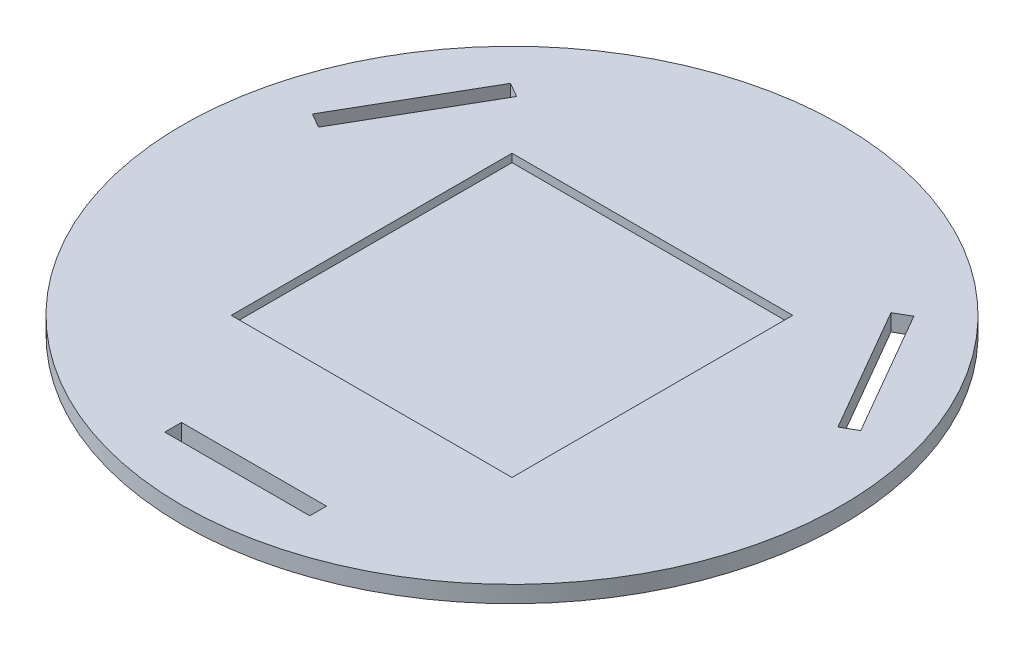
ISO-10303-21;
HEADER;
FILE_DESCRIPTION(('STEP AP214'),'2;1');
FILE_NAME('part.step','',(''),(''),'','','');
FILE_SCHEMA(('AUTOMOTIVE_DESIGN { 1 0 10303 214 1 1 1 1 }'));
ENDSEC;
DATA;
#1=APPLICATION_CONTEXT('core data for automotive mechanical design processes');
#2=APPLICATION_PROTOCOL_DEFINITION('international standard','automotive_design',2000,#1);
#3=PRODUCT_CONTEXT('',#1,'mechanical');
#4=PRODUCT('Part','Part','',(#3));
#5=PRODUCT_RELATED_PRODUCT_CATEGORY('part','',(#4));
#6=PRODUCT_DEFINITION_FORMATION('','',#4);
#7=PRODUCT_DEFINITION_CONTEXT('part definition',#1,'design');
#8=PRODUCT_DEFINITION('design','',#6,#7);
#9=PRODUCT_DEFINITION_SHAPE('','',#8);
#10=(LENGTH_UNIT() NAMED_UNIT(*) SI_UNIT(.MILLI.,.METRE.));
#11=(NAMED_UNIT(*) PLANE_ANGLE_UNIT() SI_UNIT($,.RADIAN.));
#12=(NAMED_UNIT(*) SI_UNIT($,.STERADIAN.) SOLID_ANGLE_UNIT());
#13=UNCERTAINTY_MEASURE_WITH_UNIT(LENGTH_MEASURE(1.E-05),#10,'distance_accuracy_value','');
#14=(GEOMETRIC_REPRESENTATION_CONTEXT(3) GLOBAL_UNCERTAINTY_ASSIGNED_CONTEXT((#13)) GLOBAL_UNIT_ASSIGNED_CONTEXT((#10,
#11,#12)) REPRESENTATION_CONTEXT('',''));
#15=CARTESIAN_POINT('',(0.,0.,0.));
#16=DIRECTION('',(0.,0.,1.));
#17=DIRECTION('',(1.,0.,0.));
#18=AXIS2_PLACEMENT_3D('',#15,#16,#17);
#19=CARTESIAN_POINT('',(0.,6.35,0.));
#20=DIRECTION('',(0.,-1.,0.));
#21=DIRECTION('',(0.,0.,-1.));
#22=AXIS2_PLACEMENT_3D('',#19,#20,#21);
#23=CYLINDRICAL_SURFACE('',#22,125.);
#24=CARTESIAN_POINT('',(0.,6.35,0.));
#25=DIRECTION('',(0.,1.,0.));
#26=DIRECTION('',(0.,0.,1.));
#27=AXIS2_PLACEMENT_3D('',#24,#25,#26);
#28=CIRCLE('',#27,125.);
#29=CARTESIAN_POINT('',(0.,6.35,125.));
#30=VERTEX_POINT('',#29);
#31=EDGE_CURVE('E11',#30,#30,#28,.T.);
#32=ORIENTED_EDGE('',*,*,#31,.F.);
#33=EDGE_LOOP('',(#32));
#34=FACE_BOUND('',#33,.T.);
#35=CARTESIAN_POINT('',(0.,0.,0.));
#36=DIRECTION('',(0.,1.,0.));
#37=DIRECTION('',(0.,0.,1.));
#38=AXIS2_PLACEMENT_3D('',#35,#36,#37);
#39=CIRCLE('',#38,125.);
#40=CARTESIAN_POINT('',(0.,0.,125.));
#41=VERTEX_POINT('',#40);
#42=EDGE_CURVE('E39',#41,#41,#39,.T.);
#43=ORIENTED_EDGE('',*,*,#42,.T.);
#44=EDGE_LOOP('',(#43));
#45=FACE_BOUND('',#44,.T.);
#46=ADVANCED_FACE('F36',(#34,#45),#23,.T.);
#47=CARTESIAN_POINT('',(0.,6.35,0.));
#48=DIRECTION('',(0.,1.,0.));
#49=DIRECTION('',(0.,0.,1.));
#50=AXIS2_PLACEMENT_3D('',#47,#48,#49);
#51=PLANE('',#50);
#52=DIRECTION('',(0.,0.,1.));
#53=VECTOR('',#52,1.);
#54=CARTESIAN_POINT('',(-53.25,6.35,-53.25));
#55=LINE('',#54,#53);
#56=CARTESIAN_POINT('',(-53.25,6.35,-53.25));
#57=VERTEX_POINT('',#56);
#58=CARTESIAN_POINT('',(-53.25,6.35,53.25));
#59=VERTEX_POINT('',#58);
#60=EDGE_CURVE('E50',#57,#59,#55,.T.);
#61=ORIENTED_EDGE('',*,*,#60,.F.);
#62=DIRECTION('',(-1.,0.,0.));
#63=VECTOR('',#62,1.);
#64=CARTESIAN_POINT('',(-53.25,6.35,-53.25));
#65=LINE('',#64,#63);
#66=CARTESIAN_POINT('',(53.25,6.35,-53.25));
#67=VERTEX_POINT('',#66);
#68=EDGE_CURVE('E168',#67,#57,#65,.T.);
#69=ORIENTED_EDGE('',*,*,#68,.F.);
#70=DIRECTION('',(0.,0.,-1.));
#71=VECTOR('',#70,1.);
#72=CARTESIAN_POINT('',(53.25,6.35,-53.25));
#73=LINE('',#72,#71);
#74=CARTESIAN_POINT('',(53.25,6.35,53.25));
#75=VERTEX_POINT('',#74);
#76=EDGE_CURVE('E171',#75,#67,#73,.T.);
#77=ORIENTED_EDGE('',*,*,#76,.F.);
#78=DIRECTION('',(1.,0.,0.));
#79=VECTOR('',#78,1.);
#80=CARTESIAN_POINT('',(-53.25,6.35,53.25));
#81=LINE('',#80,#79);
#82=EDGE_CURVE('E177',#59,#75,#81,.T.);
#83=ORIENTED_EDGE('',*,*,#82,.F.);
#84=EDGE_LOOP('',(#61,#69,#77,#83));
#85=FACE_BOUND('',#84,.T.);
#86=DIRECTION('',(0.5,0.,-0.866025403784439));
#87=VECTOR('',#86,1.);
#88=CARTESIAN_POINT('',(-98.5003693429845,6.35,-25.1149499500204));
#89=LINE('',#88,#87);
#90=CARTESIAN_POINT('',(-98.5003693429845,6.35,-25.1149499500204));
#91=VERTEX_POINT('',#90);
#92=CARTESIAN_POINT('',(-71.0003693429846,6.35,-72.7463471581644));
#93=VERTEX_POINT('',#92);
#94=EDGE_CURVE('E58',#91,#93,#89,.T.);
#95=ORIENTED_EDGE('',*,*,#94,.F.);
#96=DIRECTION('',(0.866025403784442,0.,0.499999999999994));
#97=VECTOR('',#96,1.);
#98=CARTESIAN_POINT('',(-98.5003693429845,6.35,-25.1149499500204));
#99=LINE('',#98,#97);
#100=CARTESIAN_POINT('',(-103.999630657016,6.35,-28.2899499500204));
#101=VERTEX_POINT('',#100);
#102=EDGE_CURVE('E191',#101,#91,#99,.T.);
#103=ORIENTED_EDGE('',*,*,#102,.F.);
#104=DIRECTION('',(-0.5,0.,0.866025403784439));
#105=VECTOR('',#104,1.);
#106=CARTESIAN_POINT('',(-103.999630657016,6.35,-28.2899499500204));
#107=LINE('',#106,#105);
#108=CARTESIAN_POINT('',(-76.4996306570159,6.35,-75.9213471581646));
#109=VERTEX_POINT('',#108);
#110=EDGE_CURVE('E206',#109,#101,#107,.T.);
#111=ORIENTED_EDGE('',*,*,#110,.F.);
#112=DIRECTION('',(-0.866025403784431,0.,-0.500000000000014));
#113=VECTOR('',#112,1.);
#114=CARTESIAN_POINT('',(-71.0003693429846,6.35,-72.7463471581644));
#115=LINE('',#114,#113);
#116=EDGE_CURVE('E202',#93,#109,#115,.T.);
#117=ORIENTED_EDGE('',*,*,#116,.F.);
#118=EDGE_LOOP('',(#95,#103,#111,#117));
#119=FACE_BOUND('',#118,.T.);
#120=DIRECTION('',(-0.866025403784439,0.,0.5));
#121=VECTOR('',#120,1.);
#122=CARTESIAN_POINT('',(76.4996306570162,6.35,-75.9213471581631));
#123=LINE('',#122,#121);
#124=CARTESIAN_POINT('',(76.4996306570162,6.35,-75.9213471581631));
#125=VERTEX_POINT('',#124);
#126=CARTESIAN_POINT('',(71.000369342985,6.35,-72.7463471581631));
#127=VERTEX_POINT('',#126);
#128=EDGE_CURVE('E232',#125,#127,#123,.T.);
#129=ORIENTED_EDGE('',*,*,#128,.F.);
#130=DIRECTION('',(-0.5,0.,-0.866025403784439));
#131=VECTOR('',#130,1.);
#132=CARTESIAN_POINT('',(103.999630657016,6.35,-28.289949950019));
#133=LINE('',#132,#131);
#134=CARTESIAN_POINT('',(103.999630657016,6.35,-28.289949950019));
#135=VERTEX_POINT('',#134);
#136=EDGE_CURVE('E222',#135,#125,#133,.T.);
#137=ORIENTED_EDGE('',*,*,#136,.F.);
#138=DIRECTION('',(0.866025403784438,0.,-0.5));
#139=VECTOR('',#138,1.);
#140=CARTESIAN_POINT('',(98.500369342985,6.35,-25.114949950019));
#141=LINE('',#140,#139);
#142=CARTESIAN_POINT('',(98.500369342985,6.35,-25.114949950019));
#143=VERTEX_POINT('',#142);
#144=EDGE_CURVE('E238',#143,#135,#141,.T.);
#145=ORIENTED_EDGE('',*,*,#144,.F.);
#146=DIRECTION('',(0.5,0.,0.866025403784439));
#147=VECTOR('',#146,1.);
#148=CARTESIAN_POINT('',(71.000369342985,6.35,-72.7463471581631));
#149=LINE('',#148,#147);
#150=EDGE_CURVE('E234',#127,#143,#149,.T.);
#151=ORIENTED_EDGE('',*,*,#150,.F.);
#152=EDGE_LOOP('',(#129,#137,#145,#151));
#153=FACE_BOUND('',#152,.T.);
#154=DIRECTION('',(0.,0.,1.));
#155=VECTOR('',#154,1.);
#156=CARTESIAN_POINT('',(-27.5000000000002,6.35,97.8612971081842));
#157=LINE('',#156,#155);
#158=CARTESIAN_POINT('',(-27.5000000000002,6.35,97.8612971081842));
#159=VERTEX_POINT('',#158);
#160=CARTESIAN_POINT('',(-27.5000000000002,6.35,104.211297108184));
#161=VERTEX_POINT('',#160);
#162=EDGE_CURVE('E183',#159,#161,#157,.T.);
#163=ORIENTED_EDGE('',*,*,#162,.F.);
#164=DIRECTION('',(-1.,0.,0.));
#165=VECTOR('',#164,1.);
#166=CARTESIAN_POINT('',(-27.5000000000002,6.35,97.8612971081842));
#167=LINE('',#166,#165);
#168=CARTESIAN_POINT('',(27.4999999999998,6.35,97.8612971081842));
#169=VERTEX_POINT('',#168);
#170=EDGE_CURVE('E254',#169,#159,#167,.T.);
#171=ORIENTED_EDGE('',*,*,#170,.F.);
#172=DIRECTION('',(0.,0.,-1.));
#173=VECTOR('',#172,1.);
#174=CARTESIAN_POINT('',(27.4999999999998,6.35,97.8612971081842));
#175=LINE('',#174,#173);
#176=CARTESIAN_POINT('',(27.4999999999998,6.35,104.211297108184));
#177=VERTEX_POINT('',#176);
#178=EDGE_CURVE('E268',#177,#169,#175,.T.);
#179=ORIENTED_EDGE('',*,*,#178,.F.);
#180=DIRECTION('',(1.,0.,0.));
#181=VECTOR('',#180,1.);
#182=CARTESIAN_POINT('',(-27.5000000000002,6.35,104.211297108184));
#183=LINE('',#182,#181);
#184=EDGE_CURVE('E265',#161,#177,#183,.T.);
#185=ORIENTED_EDGE('',*,*,#184,.F.);
#186=EDGE_LOOP('',(#163,#171,#179,#185));
#187=FACE_BOUND('',#186,.T.);
#188=ORIENTED_EDGE('',*,*,#31,.T.);
#189=EDGE_LOOP('',(#188));
#190=FACE_BOUND('',#189,.T.);
#191=ADVANCED_FACE('F289',(#85,#119,#153,#187,#190),#51,.T.);
#192=CARTESIAN_POINT('',(0.,0.,0.));
#193=DIRECTION('',(0.,1.,0.));
#194=DIRECTION('',(0.,0.,1.));
#195=AXIS2_PLACEMENT_3D('',#192,#193,#194);
#196=PLANE('',#195);
#197=DIRECTION('',(0.866025403784442,0.,0.499999999999994));
#198=VECTOR('',#197,1.);
#199=CARTESIAN_POINT('',(-98.5003693429845,0.,-25.1149499500204));
#200=LINE('',#199,#198);
#201=CARTESIAN_POINT('',(-103.999630657016,0.,-28.2899499500204));
#202=VERTEX_POINT('',#201);
#203=CARTESIAN_POINT('',(-98.5003693429845,0.,-25.1149499500204));
#204=VERTEX_POINT('',#203);
#205=EDGE_CURVE('E197',#202,#204,#200,.T.);
#206=ORIENTED_EDGE('',*,*,#205,.T.);
#207=DIRECTION('',(0.5,0.,-0.866025403784439));
#208=VECTOR('',#207,1.);
#209=CARTESIAN_POINT('',(-98.5003693429845,0.,-25.1149499500204));
#210=LINE('',#209,#208);
#211=CARTESIAN_POINT('',(-71.0003693429846,0.,-72.7463471581644));
#212=VERTEX_POINT('',#211);
#213=EDGE_CURVE('E187',#204,#212,#210,.T.);
#214=ORIENTED_EDGE('',*,*,#213,.T.);
#215=DIRECTION('',(-0.866025403784431,0.,-0.500000000000014));
#216=VECTOR('',#215,1.);
#217=CARTESIAN_POINT('',(-71.0003693429846,0.,-72.7463471581644));
#218=LINE('',#217,#216);
#219=CARTESIAN_POINT('',(-76.4996306570159,0.,-75.9213471581646));
#220=VERTEX_POINT('',#219);
#221=EDGE_CURVE('E190',#212,#220,#218,.T.);
#222=ORIENTED_EDGE('',*,*,#221,.T.);
#223=DIRECTION('',(-0.5,0.,0.866025403784439));
#224=VECTOR('',#223,1.);
#225=CARTESIAN_POINT('',(-103.999630657016,0.,-28.2899499500204));
#226=LINE('',#225,#224);
#227=EDGE_CURVE('E194',#220,#202,#226,.T.);
#228=ORIENTED_EDGE('',*,*,#227,.T.);
#229=EDGE_LOOP('',(#206,#214,#222,#228));
#230=FACE_BOUND('',#229,.T.);
#231=DIRECTION('',(-0.5,0.,-0.866025403784439));
#232=VECTOR('',#231,1.);
#233=CARTESIAN_POINT('',(103.999630657016,0.,-28.289949950019));
#234=LINE('',#233,#232);
#235=CARTESIAN_POINT('',(103.999630657016,0.,-28.289949950019));
#236=VERTEX_POINT('',#235);
#237=CARTESIAN_POINT('',(76.4996306570162,0.,-75.9213471581631));
#238=VERTEX_POINT('',#237);
#239=EDGE_CURVE('E228',#236,#238,#234,.T.);
#240=ORIENTED_EDGE('',*,*,#239,.T.);
#241=DIRECTION('',(-0.866025403784439,0.,0.5));
#242=VECTOR('',#241,1.);
#243=CARTESIAN_POINT('',(76.4996306570162,0.,-75.9213471581631));
#244=LINE('',#243,#242);
#245=CARTESIAN_POINT('',(71.000369342985,0.,-72.7463471581631));
#246=VERTEX_POINT('',#245);
#247=EDGE_CURVE('E218',#238,#246,#244,.T.);
#248=ORIENTED_EDGE('',*,*,#247,.T.);
#249=DIRECTION('',(0.5,0.,0.866025403784439));
#250=VECTOR('',#249,1.);
#251=CARTESIAN_POINT('',(71.000369342985,0.,-72.7463471581631));
#252=LINE('',#251,#250);
#253=CARTESIAN_POINT('',(98.500369342985,0.,-25.114949950019));
#254=VERTEX_POINT('',#253);
#255=EDGE_CURVE('E221',#246,#254,#252,.T.);
#256=ORIENTED_EDGE('',*,*,#255,.T.);
#257=DIRECTION('',(0.866025403784438,0.,-0.5));
#258=VECTOR('',#257,1.);
#259=CARTESIAN_POINT('',(98.500369342985,0.,-25.114949950019));
#260=LINE('',#259,#258);
#261=EDGE_CURVE('E225',#254,#236,#260,.T.);
#262=ORIENTED_EDGE('',*,*,#261,.T.);
#263=EDGE_LOOP('',(#240,#248,#256,#262));
#264=FACE_BOUND('',#263,.T.);
#265=DIRECTION('',(-1.,0.,0.));
#266=VECTOR('',#265,1.);
#267=CARTESIAN_POINT('',(-27.5000000000002,0.,97.8612971081842));
#268=LINE('',#267,#266);
#269=CARTESIAN_POINT('',(27.4999999999998,0.,97.8612971081842));
#270=VERTEX_POINT('',#269);
#271=CARTESIAN_POINT('',(-27.5000000000002,0.,97.8612971081842));
#272=VERTEX_POINT('',#271);
#273=EDGE_CURVE('E260',#270,#272,#268,.T.);
#274=ORIENTED_EDGE('',*,*,#273,.T.);
#275=DIRECTION('',(0.,0.,1.));
#276=VECTOR('',#275,1.);
#277=CARTESIAN_POINT('',(-27.5000000000002,0.,97.8612971081842));
#278=LINE('',#277,#276);
#279=CARTESIAN_POINT('',(-27.5000000000002,0.,104.211297108184));
#280=VERTEX_POINT('',#279);
#281=EDGE_CURVE('E250',#272,#280,#278,.T.);
#282=ORIENTED_EDGE('',*,*,#281,.T.);
#283=DIRECTION('',(1.,0.,0.));
#284=VECTOR('',#283,1.);
#285=CARTESIAN_POINT('',(-27.5000000000002,0.,104.211297108184));
#286=LINE('',#285,#284);
#287=CARTESIAN_POINT('',(27.4999999999998,0.,104.211297108184));
#288=VERTEX_POINT('',#287);
#289=EDGE_CURVE('E253',#280,#288,#286,.T.);
#290=ORIENTED_EDGE('',*,*,#289,.T.);
#291=DIRECTION('',(0.,0.,-1.));
#292=VECTOR('',#291,1.);
#293=CARTESIAN_POINT('',(27.4999999999998,0.,97.8612971081842));
#294=LINE('',#293,#292);
#295=EDGE_CURVE('E257',#288,#270,#294,.T.);
#296=ORIENTED_EDGE('',*,*,#295,.T.);
#297=EDGE_LOOP('',(#274,#282,#290,#296));
#298=FACE_BOUND('',#297,.T.);
#299=ORIENTED_EDGE('',*,*,#42,.F.);
#300=EDGE_LOOP('',(#299));
#301=FACE_BOUND('',#300,.T.);
#302=ADVANCED_FACE('F296',(#230,#264,#298,#301),#196,.F.);
#303=CARTESIAN_POINT('',(-27.5000000000002,0.,97.8612971081842));
#304=DIRECTION('',(-1.,0.,0.));
#305=DIRECTION('',(0.,0.,1.));
#306=AXIS2_PLACEMENT_3D('',#303,#304,#305);
#307=PLANE('',#306);
#308=ORIENTED_EDGE('',*,*,#162,.T.);
#309=DIRECTION('',(0.,1.,0.));
#310=VECTOR('',#309,1.);
#311=CARTESIAN_POINT('',(-27.5000000000002,0.,104.211297108184));
#312=LINE('',#311,#310);
#313=EDGE_CURVE('E263',#280,#161,#312,.T.);
#314=ORIENTED_EDGE('',*,*,#313,.F.);
#315=ORIENTED_EDGE('',*,*,#281,.F.);
#316=DIRECTION('',(0.,1.,0.));
#317=VECTOR('',#316,1.);
#318=CARTESIAN_POINT('',(-27.5000000000002,0.,97.8612971081842));
#319=LINE('',#318,#317);
#320=EDGE_CURVE('E235',#272,#159,#319,.T.);
#321=ORIENTED_EDGE('',*,*,#320,.T.);
#322=EDGE_LOOP('',(#308,#314,#315,#321));
#323=FACE_BOUND('',#322,.T.);
#324=ADVANCED_FACE('F298',(#323),#307,.F.);
#325=CARTESIAN_POINT('',(-27.5000000000002,0.,97.8612971081842));
#326=DIRECTION('',(0.,0.,-1.));
#327=DIRECTION('',(-1.,0.,0.));
#328=AXIS2_PLACEMENT_3D('',#325,#326,#327);
#329=PLANE('',#328);
#330=ORIENTED_EDGE('',*,*,#170,.T.);
#331=ORIENTED_EDGE('',*,*,#320,.F.);
#332=ORIENTED_EDGE('',*,*,#273,.F.);
#333=DIRECTION('',(0.,1.,0.));
#334=VECTOR('',#333,1.);
#335=CARTESIAN_POINT('',(27.4999999999998,0.,97.8612971081842));
#336=LINE('',#335,#334);
#337=EDGE_CURVE('E274',#270,#169,#336,.T.);
#338=ORIENTED_EDGE('',*,*,#337,.T.);
#339=EDGE_LOOP('',(#330,#331,#332,#338));
#340=FACE_BOUND('',#339,.T.);
#341=ADVANCED_FACE('F300',(#340),#329,.F.);
#342=CARTESIAN_POINT('',(27.4999999999998,0.,97.8612971081842));
#343=DIRECTION('',(1.,0.,0.));
#344=DIRECTION('',(0.,0.,-1.));
#345=AXIS2_PLACEMENT_3D('',#342,#343,#344);
#346=PLANE('',#345);
#347=ORIENTED_EDGE('',*,*,#178,.T.);
#348=ORIENTED_EDGE('',*,*,#337,.F.);
#349=ORIENTED_EDGE('',*,*,#295,.F.);
#350=DIRECTION('',(0.,1.,0.));
#351=VECTOR('',#350,1.);
#352=CARTESIAN_POINT('',(27.4999999999998,0.,104.211297108184));
#353=LINE('',#352,#351);
#354=EDGE_CURVE('E276',#288,#177,#353,.T.);
#355=ORIENTED_EDGE('',*,*,#354,.T.);
#356=EDGE_LOOP('',(#347,#348,#349,#355));
#357=FACE_BOUND('',#356,.T.);
#358=ADVANCED_FACE('F293',(#357),#346,.F.);
#359=CARTESIAN_POINT('',(-27.5000000000002,0.,104.211297108184));
#360=DIRECTION('',(0.,0.,1.));
#361=DIRECTION('',(1.,0.,0.));
#362=AXIS2_PLACEMENT_3D('',#359,#360,#361);
#363=PLANE('',#362);
#364=ORIENTED_EDGE('',*,*,#184,.T.);
#365=ORIENTED_EDGE('',*,*,#354,.F.);
#366=ORIENTED_EDGE('',*,*,#289,.F.);
#367=ORIENTED_EDGE('',*,*,#313,.T.);
#368=EDGE_LOOP('',(#364,#365,#366,#367));
#369=FACE_BOUND('',#368,.T.);
#370=ADVANCED_FACE('F282',(#369),#363,.F.);
#371=CARTESIAN_POINT('',(76.4996306570162,0.,-75.9213471581631));
#372=DIRECTION('',(-0.5,0.,-0.866025403784439));
#373=DIRECTION('',(-0.866025403784439,0.,0.5));
#374=AXIS2_PLACEMENT_3D('',#371,#372,#373);
#375=PLANE('',#374);
#376=ORIENTED_EDGE('',*,*,#128,.T.);
#377=DIRECTION('',(0.,1.,0.));
#378=VECTOR('',#377,1.);
#379=CARTESIAN_POINT('',(71.000369342985,0.,-72.7463471581631));
#380=LINE('',#379,#378);
#381=EDGE_CURVE('E231',#246,#127,#380,.T.);
#382=ORIENTED_EDGE('',*,*,#381,.F.);
#383=ORIENTED_EDGE('',*,*,#247,.F.);
#384=DIRECTION('',(0.,1.,0.));
#385=VECTOR('',#384,1.);
#386=CARTESIAN_POINT('',(76.4996306570162,0.,-75.9213471581631));
#387=LINE('',#386,#385);
#388=EDGE_CURVE('E203',#238,#125,#387,.T.);
#389=ORIENTED_EDGE('',*,*,#388,.T.);
#390=EDGE_LOOP('',(#376,#382,#383,#389));
#391=FACE_BOUND('',#390,.T.);
#392=ADVANCED_FACE('F328',(#391),#375,.F.);
#393=CARTESIAN_POINT('',(103.999630657016,0.,-28.289949950019));
#394=DIRECTION('',(0.866025403784438,0.,-0.5));
#395=DIRECTION('',(-0.5,0.,-0.866025403784439));
#396=AXIS2_PLACEMENT_3D('',#393,#394,#395);
#397=PLANE('',#396);
#398=ORIENTED_EDGE('',*,*,#136,.T.);
#399=ORIENTED_EDGE('',*,*,#388,.F.);
#400=ORIENTED_EDGE('',*,*,#239,.F.);
#401=DIRECTION('',(0.,1.,0.));
#402=VECTOR('',#401,1.);
#403=CARTESIAN_POINT('',(103.999630657016,0.,-28.289949950019));
#404=LINE('',#403,#402);
#405=EDGE_CURVE('E244',#236,#135,#404,.T.);
#406=ORIENTED_EDGE('',*,*,#405,.T.);
#407=EDGE_LOOP('',(#398,#399,#400,#406));
#408=FACE_BOUND('',#407,.T.);
#409=ADVANCED_FACE('F332',(#408),#397,.F.);
#410=CARTESIAN_POINT('',(98.500369342985,0.,-25.114949950019));
#411=DIRECTION('',(0.5,0.,0.866025403784438));
#412=DIRECTION('',(0.866025403784439,0.,-0.5));
#413=AXIS2_PLACEMENT_3D('',#410,#411,#412);
#414=PLANE('',#413);
#415=ORIENTED_EDGE('',*,*,#144,.T.);
#416=ORIENTED_EDGE('',*,*,#405,.F.);
#417=ORIENTED_EDGE('',*,*,#261,.F.);
#418=DIRECTION('',(0.,1.,0.));
#419=VECTOR('',#418,1.);
#420=CARTESIAN_POINT('',(98.500369342985,0.,-25.114949950019));
#421=LINE('',#420,#419);
#422=EDGE_CURVE('E246',#254,#143,#421,.T.);
#423=ORIENTED_EDGE('',*,*,#422,.T.);
#424=EDGE_LOOP('',(#415,#416,#417,#423));
#425=FACE_BOUND('',#424,.T.);
#426=ADVANCED_FACE('F337',(#425),#414,.F.);
#427=CARTESIAN_POINT('',(71.000369342985,0.,-72.7463471581631));
#428=DIRECTION('',(-0.866025403784439,0.,0.5));
#429=DIRECTION('',(0.5,0.,0.866025403784439));
#430=AXIS2_PLACEMENT_3D('',#427,#428,#429);
#431=PLANE('',#430);
#432=ORIENTED_EDGE('',*,*,#150,.T.);
#433=ORIENTED_EDGE('',*,*,#422,.F.);
#434=ORIENTED_EDGE('',*,*,#255,.F.);
#435=ORIENTED_EDGE('',*,*,#381,.T.);
#436=EDGE_LOOP('',(#432,#433,#434,#435));
#437=FACE_BOUND('',#436,.T.);
#438=ADVANCED_FACE('F341',(#437),#431,.F.);
#439=CARTESIAN_POINT('',(-98.5003693429845,0.,-25.1149499500204));
#440=DIRECTION('',(0.866025403784439,0.,0.5));
#441=DIRECTION('',(0.5,0.,-0.866025403784439));
#442=AXIS2_PLACEMENT_3D('',#439,#440,#441);
#443=PLANE('',#442);
#444=ORIENTED_EDGE('',*,*,#94,.T.);
#445=DIRECTION('',(0.,1.,0.));
#446=VECTOR('',#445,1.);
#447=CARTESIAN_POINT('',(-71.0003693429846,0.,-72.7463471581644));
#448=LINE('',#447,#446);
#449=EDGE_CURVE('E200',#212,#93,#448,.T.);
#450=ORIENTED_EDGE('',*,*,#449,.F.);
#451=ORIENTED_EDGE('',*,*,#213,.F.);
#452=DIRECTION('',(0.,1.,0.));
#453=VECTOR('',#452,1.);
#454=CARTESIAN_POINT('',(-98.5003693429845,0.,-25.1149499500204));
#455=LINE('',#454,#453);
#456=EDGE_CURVE('E211',#204,#91,#455,.T.);
#457=ORIENTED_EDGE('',*,*,#456,.T.);
#458=EDGE_LOOP('',(#444,#450,#451,#457));
#459=FACE_BOUND('',#458,.T.);
#460=ADVANCED_FACE('F344',(#459),#443,.F.);
#461=CARTESIAN_POINT('',(-98.5003693429845,0.,-25.1149499500204));
#462=DIRECTION('',(-0.499999999999994,0.,0.866025403784442));
#463=DIRECTION('',(0.866025403784442,0.,0.499999999999994));
#464=AXIS2_PLACEMENT_3D('',#461,#462,#463);
#465=PLANE('',#464);
#466=ORIENTED_EDGE('',*,*,#102,.T.);
#467=ORIENTED_EDGE('',*,*,#456,.F.);
#468=ORIENTED_EDGE('',*,*,#205,.F.);
#469=DIRECTION('',(0.,1.,0.));
#470=VECTOR('',#469,1.);
#471=CARTESIAN_POINT('',(-103.999630657016,0.,-28.2899499500204));
#472=LINE('',#471,#470);
#473=EDGE_CURVE('E213',#202,#101,#472,.T.);
#474=ORIENTED_EDGE('',*,*,#473,.T.);
#475=EDGE_LOOP('',(#466,#467,#468,#474));
#476=FACE_BOUND('',#475,.T.);
#477=ADVANCED_FACE('F351',(#476),#465,.F.);
#478=CARTESIAN_POINT('',(-103.999630657016,0.,-28.2899499500204));
#479=DIRECTION('',(-0.866025403784439,0.,-0.5));
#480=DIRECTION('',(-0.5,0.,0.866025403784439));
#481=AXIS2_PLACEMENT_3D('',#478,#479,#480);
#482=PLANE('',#481);
#483=ORIENTED_EDGE('',*,*,#110,.T.);
#484=ORIENTED_EDGE('',*,*,#473,.F.);
#485=ORIENTED_EDGE('',*,*,#227,.F.);
#486=DIRECTION('',(0.,1.,0.));
#487=VECTOR('',#486,1.);
#488=CARTESIAN_POINT('',(-76.4996306570159,0.,-75.9213471581646));
#489=LINE('',#488,#487);
#490=EDGE_CURVE('E215',#220,#109,#489,.T.);
#491=ORIENTED_EDGE('',*,*,#490,.T.);
#492=EDGE_LOOP('',(#483,#484,#485,#491));
#493=FACE_BOUND('',#492,.T.);
#494=ADVANCED_FACE('F355',(#493),#482,.F.);
#495=CARTESIAN_POINT('',(-71.0003693429846,0.,-72.7463471581644));
#496=DIRECTION('',(0.500000000000014,0.,-0.866025403784431));
#497=DIRECTION('',(-0.866025403784431,0.,-0.500000000000014));
#498=AXIS2_PLACEMENT_3D('',#495,#496,#497);
#499=PLANE('',#498);
#500=ORIENTED_EDGE('',*,*,#116,.T.);
#501=ORIENTED_EDGE('',*,*,#490,.F.);
#502=ORIENTED_EDGE('',*,*,#221,.F.);
#503=ORIENTED_EDGE('',*,*,#449,.T.);
#504=EDGE_LOOP('',(#500,#501,#502,#503));
#505=FACE_BOUND('',#504,.T.);
#506=ADVANCED_FACE('F352',(#505),#499,.F.);
#507=CARTESIAN_POINT('',(-53.25,3.25,-53.25));
#508=DIRECTION('',(-1.,0.,0.));
#509=DIRECTION('',(0.,0.,1.));
#510=AXIS2_PLACEMENT_3D('',#507,#508,#509);
#511=PLANE('',#510);
#512=ORIENTED_EDGE('',*,*,#60,.T.);
#513=DIRECTION('',(0.,1.,0.));
#514=VECTOR('',#513,1.);
#515=CARTESIAN_POINT('',(-53.25,3.25,53.25));
#516=LINE('',#515,#514);
#517=CARTESIAN_POINT('',(-53.25,3.25,53.25));
#518=VERTEX_POINT('',#517);
#519=EDGE_CURVE('E146',#518,#59,#516,.T.);
#520=ORIENTED_EDGE('',*,*,#519,.F.);
#521=DIRECTION('',(0.,0.,1.));
#522=VECTOR('',#521,1.);
#523=CARTESIAN_POINT('',(-53.25,3.25,-53.25));
#524=LINE('',#523,#522);
#525=CARTESIAN_POINT('',(-53.25,3.25,-53.25));
#526=VERTEX_POINT('',#525);
#527=EDGE_CURVE('E150',#526,#518,#524,.T.);
#528=ORIENTED_EDGE('',*,*,#527,.F.);
#529=DIRECTION('',(0.,1.,0.));
#530=VECTOR('',#529,1.);
#531=CARTESIAN_POINT('',(-53.25,3.25,-53.25));
#532=LINE('',#531,#530);
#533=EDGE_CURVE('E181',#526,#57,#532,.T.);
#534=ORIENTED_EDGE('',*,*,#533,.T.);
#535=EDGE_LOOP('',(#512,#520,#528,#534));
#536=FACE_BOUND('',#535,.T.);
#537=ADVANCED_FACE('F148',(#536),#511,.F.);
#538=CARTESIAN_POINT('',(-53.25,3.25,-53.25));
#539=DIRECTION('',(0.,0.,-1.));
#540=DIRECTION('',(-1.,0.,0.));
#541=AXIS2_PLACEMENT_3D('',#538,#539,#540);
#542=PLANE('',#541);
#543=ORIENTED_EDGE('',*,*,#68,.T.);
#544=ORIENTED_EDGE('',*,*,#533,.F.);
#545=DIRECTION('',(-1.,0.,0.));
#546=VECTOR('',#545,1.);
#547=CARTESIAN_POINT('',(-53.25,3.25,-53.25));
#548=LINE('',#547,#546);
#549=CARTESIAN_POINT('',(53.25,3.25,-53.25));
#550=VERTEX_POINT('',#549);
#551=EDGE_CURVE('E156',#550,#526,#548,.T.);
#552=ORIENTED_EDGE('',*,*,#551,.F.);
#553=DIRECTION('',(0.,1.,0.));
#554=VECTOR('',#553,1.);
#555=CARTESIAN_POINT('',(53.25,3.25,-53.25));
#556=LINE('',#555,#554);
#557=EDGE_CURVE('E184',#550,#67,#556,.T.);
#558=ORIENTED_EDGE('',*,*,#557,.T.);
#559=EDGE_LOOP('',(#543,#544,#552,#558));
#560=FACE_BOUND('',#559,.T.);
#561=ADVANCED_FACE('F365',(#560),#542,.F.);
#562=CARTESIAN_POINT('',(53.25,3.25,-53.25));
#563=DIRECTION('',(1.,0.,0.));
#564=DIRECTION('',(0.,0.,-1.));
#565=AXIS2_PLACEMENT_3D('',#562,#563,#564);
#566=PLANE('',#565);
#567=ORIENTED_EDGE('',*,*,#76,.T.);
#568=ORIENTED_EDGE('',*,*,#557,.F.);
#569=DIRECTION('',(0.,0.,-1.));
#570=VECTOR('',#569,1.);
#571=CARTESIAN_POINT('',(53.25,3.25,-53.25));
#572=LINE('',#571,#570);
#573=CARTESIAN_POINT('',(53.25,3.25,53.25));
#574=VERTEX_POINT('',#573);
#575=EDGE_CURVE('E164',#574,#550,#572,.T.);
#576=ORIENTED_EDGE('',*,*,#575,.F.);
#577=DIRECTION('',(0.,1.,0.));
#578=VECTOR('',#577,1.);
#579=CARTESIAN_POINT('',(53.25,3.25,53.25));
#580=LINE('',#579,#578);
#581=EDGE_CURVE('E155',#574,#75,#580,.T.);
#582=ORIENTED_EDGE('',*,*,#581,.T.);
#583=EDGE_LOOP('',(#567,#568,#576,#582));
#584=FACE_BOUND('',#583,.T.);
#585=ADVANCED_FACE('F368',(#584),#566,.F.);
#586=CARTESIAN_POINT('',(-53.25,3.25,53.25));
#587=DIRECTION('',(0.,0.,1.));
#588=DIRECTION('',(1.,0.,0.));
#589=AXIS2_PLACEMENT_3D('',#586,#587,#588);
#590=PLANE('',#589);
#591=ORIENTED_EDGE('',*,*,#82,.T.);
#592=ORIENTED_EDGE('',*,*,#581,.F.);
#593=DIRECTION('',(1.,0.,0.));
#594=VECTOR('',#593,1.);
#595=CARTESIAN_POINT('',(-53.25,3.25,53.25));
#596=LINE('',#595,#594);
#597=EDGE_CURVE('E159',#518,#574,#596,.T.);
#598=ORIENTED_EDGE('',*,*,#597,.F.);
#599=ORIENTED_EDGE('',*,*,#519,.T.);
#600=EDGE_LOOP('',(#591,#592,#598,#599));
#601=FACE_BOUND('',#600,.T.);
#602=ADVANCED_FACE('F160',(#601),#590,.F.);
#603=CARTESIAN_POINT('',(0.,3.25,0.));
#604=DIRECTION('',(0.,1.,0.));
#605=DIRECTION('',(0.,0.,1.));
#606=AXIS2_PLACEMENT_3D('',#603,#604,#605);
#607=PLANE('',#606);
#608=ORIENTED_EDGE('',*,*,#527,.T.);
#609=ORIENTED_EDGE('',*,*,#597,.T.);
#610=ORIENTED_EDGE('',*,*,#575,.T.);
#611=ORIENTED_EDGE('',*,*,#551,.T.);
#612=EDGE_LOOP('',(#608,#609,#610,#611));
#613=FACE_BOUND('',#612,.T.);
#614=ADVANCED_FACE('F166',(#613),#607,.T.);
#615=CLOSED_SHELL('',(#46,#191,#302,#324,#341,#358,#370,#392,#409,#426,#438,#460,#477,#494,#506,
#537,#561,#585,#602,#614));
#616=MANIFOLD_SOLID_BREP('B2',#615);
#617=ADVANCED_BREP_SHAPE_REPRESENTATION('',(#18,#616),#14);
#618=SHAPE_DEFINITION_REPRESENTATION(#9,#617);
ENDSEC;
END-ISO-10303-21;
